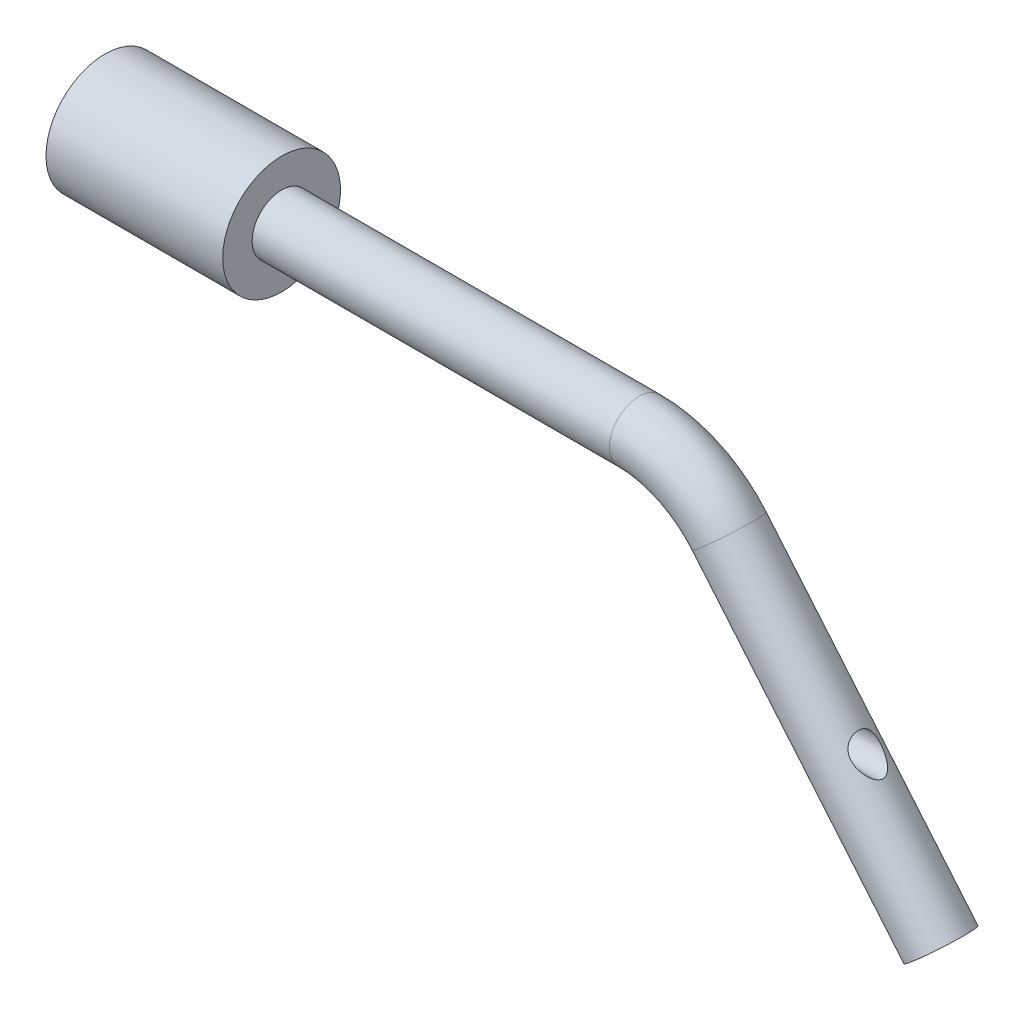
ISO-10303-21;
HEADER;
FILE_DESCRIPTION(('STEP AP214'),'2;1');
FILE_NAME('part.step','',(''),(''),'','','');
FILE_SCHEMA(('AUTOMOTIVE_DESIGN { 1 0 10303 214 1 1 1 1 }'));
ENDSEC;
DATA;
#1=APPLICATION_CONTEXT('core data for automotive mechanical design processes');
#2=APPLICATION_PROTOCOL_DEFINITION('international standard','automotive_design',2000,#1);
#3=PRODUCT_CONTEXT('',#1,'mechanical');
#4=PRODUCT('Part','Part','',(#3));
#5=PRODUCT_RELATED_PRODUCT_CATEGORY('part','',(#4));
#6=PRODUCT_DEFINITION_FORMATION('','',#4);
#7=PRODUCT_DEFINITION_CONTEXT('part definition',#1,'design');
#8=PRODUCT_DEFINITION('design','',#6,#7);
#9=PRODUCT_DEFINITION_SHAPE('','',#8);
#10=(LENGTH_UNIT() NAMED_UNIT(*) SI_UNIT(.MILLI.,.METRE.));
#11=(NAMED_UNIT(*) PLANE_ANGLE_UNIT() SI_UNIT($,.RADIAN.));
#12=(NAMED_UNIT(*) SI_UNIT($,.STERADIAN.) SOLID_ANGLE_UNIT());
#13=UNCERTAINTY_MEASURE_WITH_UNIT(LENGTH_MEASURE(1.E-05),#10,'distance_accuracy_value','');
#14=(GEOMETRIC_REPRESENTATION_CONTEXT(3) GLOBAL_UNCERTAINTY_ASSIGNED_CONTEXT((#13)) GLOBAL_UNIT_ASSIGNED_CONTEXT((#10,
#11,#12)) REPRESENTATION_CONTEXT('',''));
#15=CARTESIAN_POINT('',(0.,0.,0.));
#16=DIRECTION('',(0.,0.,1.));
#17=DIRECTION('',(1.,0.,0.));
#18=AXIS2_PLACEMENT_3D('',#15,#16,#17);
#19=CARTESIAN_POINT('',(0.,0.,0.));
#20=DIRECTION('',(1.,0.,0.));
#21=DIRECTION('',(0.,0.,-1.));
#22=AXIS2_PLACEMENT_3D('',#19,#20,#21);
#23=CYLINDRICAL_SURFACE('',#22,5.);
#24=CARTESIAN_POINT('',(90.6738468368999,0.,0.));
#25=DIRECTION('',(1.,0.,0.));
#26=DIRECTION('',(0.,0.,-1.));
#27=AXIS2_PLACEMENT_3D('',#24,#25,#26);
#28=CIRCLE('',#27,5.);
#29=CARTESIAN_POINT('',(90.6738468368999,5.,0.));
#30=VERTEX_POINT('',#29);
#31=EDGE_CURVE('E49',#30,#30,#28,.T.);
#32=ORIENTED_EDGE('',*,*,#31,.F.);
#33=EDGE_LOOP('',(#32));
#34=FACE_BOUND('',#33,.T.);
#35=CARTESIAN_POINT('',(30.,0.,0.));
#36=DIRECTION('',(-1.,0.,0.));
#37=DIRECTION('',(0.,0.,1.));
#38=AXIS2_PLACEMENT_3D('',#35,#36,#37);
#39=CIRCLE('',#38,5.);
#40=CARTESIAN_POINT('',(30.,0.,5.));
#41=VERTEX_POINT('',#40);
#42=EDGE_CURVE('E53',#41,#41,#39,.F.);
#43=ORIENTED_EDGE('',*,*,#42,.T.);
#44=EDGE_LOOP('',(#43));
#45=FACE_BOUND('',#44,.T.);
#46=ADVANCED_FACE('F31',(#34,#45),#23,.T.);
#47=CARTESIAN_POINT('',(141.954981558864,-50.,0.));
#48=DIRECTION('',(0.642787609686538,-0.766044443118979,0.));
#49=DIRECTION('',(0.,0.,-1.));
#50=AXIS2_PLACEMENT_3D('',#47,#48,#49);
#51=PLANE('',#50);
#52=CARTESIAN_POINT('',(141.954981558864,-50.,0.));
#53=DIRECTION('',(0.642787609686538,-0.766044443118979,0.));
#54=DIRECTION('',(0.,0.,-1.));
#55=AXIS2_PLACEMENT_3D('',#52,#53,#54);
#56=CIRCLE('',#55,5.);
#57=CARTESIAN_POINT('',(141.954981558864,-50.,-5.));
#58=VERTEX_POINT('',#57);
#59=EDGE_CURVE('E10',#58,#58,#56,.T.);
#60=ORIENTED_EDGE('',*,*,#59,.T.);
#61=EDGE_LOOP('',(#60));
#62=FACE_BOUND('',#61,.T.);
#63=ADVANCED_FACE('F78',(#62),#51,.T.);
#64=CARTESIAN_POINT('',(90.6738468369,-20.,0.));
#65=DIRECTION('',(0.,0.,-1.));
#66=DIRECTION('',(-1.,0.,0.));
#67=AXIS2_PLACEMENT_3D('',#64,#65,#66);
#68=TOROIDAL_SURFACE('',#67,20.,5.);
#69=CARTESIAN_POINT('',(105.99473569928,-7.14424780626931,0.));
#70=DIRECTION('',(0.642787609686534,-0.766044443118982,0.));
#71=DIRECTION('',(0.,0.,-1.));
#72=AXIS2_PLACEMENT_3D('',#69,#70,#71);
#73=CIRCLE('',#72,5.);
#74=CARTESIAN_POINT('',(109.824957914875,-3.93030975783664,0.));
#75=VERTEX_POINT('',#74);
#76=EDGE_CURVE('E44',#75,#75,#73,.T.);
#77=CARTESIAN_POINT('',(90.6738468369,-20.,0.));
#78=DIRECTION('',(0.,0.,-1.));
#79=DIRECTION('',(-1.,0.,0.));
#80=AXIS2_PLACEMENT_3D('',#77,#78,#79);
#81=CIRCLE('',#80,25.);
#82=EDGE_CURVE('',#30,#75,#81,.T.);
#83=ORIENTED_EDGE('',*,*,#31,.T.);
#84=ORIENTED_EDGE('',*,*,#76,.F.);
#85=ORIENTED_EDGE('',*,*,#82,.T.);
#86=ORIENTED_EDGE('',*,*,#82,.F.);
#87=EDGE_LOOP('',(#83,#85,#84,#86));
#88=FACE_BOUND('',#87,.T.);
#89=ADVANCED_FACE('F81',(#88),#68,.T.);
#90=CARTESIAN_POINT('',(105.99473569928,-7.14424780626931,0.));
#91=DIRECTION('',(0.642787609686538,-0.766044443118979,0.));
#92=DIRECTION('',(0.766044443118979,0.642787609686538,0.));
#93=AXIS2_PLACEMENT_3D('',#90,#91,#92);
#94=CYLINDRICAL_SURFACE('',#93,5.);
#95=CARTESIAN_POINT('',(127.924077041682,-25.5,0.));
#96=CARTESIAN_POINT('',(127.924077263838,-25.4999998009019,0.137217686490546));
#97=CARTESIAN_POINT('',(127.926150628406,-25.5113258152116,0.274432223085741));
#98=CARTESIAN_POINT('',(127.934829471353,-25.556280341531,0.545013306075348));
#99=CARTESIAN_POINT('',(127.941434785734,-25.5899080465056,0.678379991530385));
#100=CARTESIAN_POINT('',(127.960306212952,-25.6784181800909,0.937560386727098));
#101=CARTESIAN_POINT('',(127.972576365977,-25.7333157739792,1.06336863326323));
#102=CARTESIAN_POINT('',(128.004519140207,-25.8624383044972,1.3036163406416));
#103=CARTESIAN_POINT('',(128.024190589758,-25.9366601814456,1.41805759729981));
#104=CARTESIAN_POINT('',(128.072653345187,-26.1003406591129,1.63065384067217));
#105=CARTESIAN_POINT('',(128.101311560736,-26.1895686099272,1.72901650688938));
#106=CARTESIAN_POINT('',(128.169606461286,-26.3801093088825,1.90868749797591));
#107=CARTESIAN_POINT('',(128.209238728502,-26.481417184725,1.99000266250186));
#108=CARTESIAN_POINT('',(128.299359362157,-26.6890604401664,2.13235238955619));
#109=CARTESIAN_POINT('',(128.34957102308,-26.7952219568024,2.19381825198668));
#110=CARTESIAN_POINT('',(128.46116423809,-27.0104511390238,2.29894586894891));
#111=CARTESIAN_POINT('',(128.522549622098,-27.1195197900875,2.34260150213977));
#112=CARTESIAN_POINT('',(128.632016735117,-27.2989882947718,2.40086244981547));
#113=CARTESIAN_POINT('',(128.67727882858,-27.3696168737298,2.42028969901511));
#114=CARTESIAN_POINT('',(128.771502960397,-27.5099156768469,2.45254855948023));
#115=CARTESIAN_POINT('',(128.820465984016,-27.5795856399256,2.4653784072329));
#116=CARTESIAN_POINT('',(128.972285333897,-27.7865486811622,2.49477304367769));
#117=CARTESIAN_POINT('',(129.079989623984,-27.9216608783636,2.50220197942681));
#118=CARTESIAN_POINT('',(129.272174654689,-28.1464785478389,2.49747107057468));
#119=CARTESIAN_POINT('',(129.354579930744,-28.2381951602202,2.49026874482143));
#120=CARTESIAN_POINT('',(129.522648264714,-28.4174355075048,2.46655971934029));
#121=CARTESIAN_POINT('',(129.608312851483,-28.5049572300969,2.45004860165806));
#122=CARTESIAN_POINT('',(129.781968884628,-28.6759750709078,2.40849016742245));
#123=CARTESIAN_POINT('',(129.86996574719,-28.7594602605987,2.38342101310682));
#124=CARTESIAN_POINT('',(130.047102673927,-28.9222767255095,2.32526890134025));
#125=CARTESIAN_POINT('',(130.136242535344,-29.0016087251213,2.29218734709888));
#126=CARTESIAN_POINT('',(130.318372048832,-29.1593359533387,2.2167293869313));
#127=CARTESIAN_POINT('',(130.41137254391,-29.2375656179847,2.17403305948307));
#128=CARTESIAN_POINT('',(130.596667073699,-29.3896876160431,2.08008734851625));
#129=CARTESIAN_POINT('',(130.68896086774,-29.4635785244276,2.02883517590847));
#130=CARTESIAN_POINT('',(130.871354543304,-29.6065966088829,1.91755871304675));
#131=CARTESIAN_POINT('',(130.961460735221,-29.6757389048823,1.85756436463337));
#132=CARTESIAN_POINT('',(131.138301091533,-29.8090601494715,1.72798657773042));
#133=CARTESIAN_POINT('',(131.225038032462,-29.8732432299404,1.65841125930713));
#134=CARTESIAN_POINT('',(131.391504344439,-29.9946103442947,1.51013929201138));
#135=CARTESIAN_POINT('',(131.471342287974,-30.0519126247883,1.43166367667857));
#136=CARTESIAN_POINT('',(131.623312082683,-30.1596909932503,1.26321943366864));
#137=CARTESIAN_POINT('',(131.695447112212,-30.2101698989633,1.17325558014463));
#138=CARTESIAN_POINT('',(131.817749402066,-30.2949676095801,0.995617081986655));
#139=CARTESIAN_POINT('',(131.869588835608,-30.3305781444127,0.909733449166142));
#140=CARTESIAN_POINT('',(131.961388027656,-30.3932740079544,0.72893095118875));
#141=CARTESIAN_POINT('',(132.001370254106,-30.4203754661111,0.63402963009139));
#142=CARTESIAN_POINT('',(132.0581768479,-30.4587495340704,0.45897684132626));
#143=CARTESIAN_POINT('',(132.07819574656,-30.4722173321147,0.380355728918876));
#144=CARTESIAN_POINT('',(132.10702246991,-30.4915872596277,0.220180708345701));
#145=CARTESIAN_POINT('',(132.115840801845,-30.4974964798316,0.138629622762685));
#146=CARTESIAN_POINT('',(132.121393004507,-30.5012187198171,-0.025287750696442));
#147=CARTESIAN_POINT('',(132.118096324811,-30.4990112717907,-0.107655576384958));
#148=CARTESIAN_POINT('',(132.09970514866,-30.486671180842,-0.270458830530909));
#149=CARTESIAN_POINT('',(132.084602416457,-30.476533005545,-0.350892869615057));
#150=CARTESIAN_POINT('',(132.039958417005,-30.4464590840569,-0.523406880403791));
#151=CARTESIAN_POINT('',(132.008142117257,-30.4249752075342,-0.614619493250558));
#152=CARTESIAN_POINT('',(131.932819817142,-30.3737980877204,-0.789579566339376));
#153=CARTESIAN_POINT('',(131.88929306982,-30.3440902716583,-0.873313422630821));
#154=CARTESIAN_POINT('',(131.769872694095,-30.2619439130486,-1.07252841305484));
#155=CARTESIAN_POINT('',(131.688638657336,-30.2055428253632,-1.18313125694404));
#156=CARTESIAN_POINT('',(131.514320722194,-30.0826452656888,-1.38814140985642));
#157=CARTESIAN_POINT('',(131.421208129774,-30.0161242703828,-1.48250815740673));
#158=CARTESIAN_POINT('',(131.244322323398,-29.8874020959336,-1.64204908109969));
#159=CARTESIAN_POINT('',(131.161659666335,-29.8263949861898,-1.70945784100494));
#160=CARTESIAN_POINT('',(130.993089135096,-29.6997820167401,-1.83540827173603));
#161=CARTESIAN_POINT('',(130.907179159591,-29.6341731549265,-1.89394407378906));
#162=CARTESIAN_POINT('',(130.733284103796,-29.4986551884383,-2.00289908344838));
#163=CARTESIAN_POINT('',(130.645294959715,-29.4287371428499,-2.05330057256774));
#164=CARTESIAN_POINT('',(130.468475395862,-29.2849146945616,-2.14623436672073));
#165=CARTESIAN_POINT('',(130.379645170186,-29.2110111939472,-2.1887684429243));
#166=CARTESIAN_POINT('',(130.197022594473,-29.0549396854886,-2.26830343918588));
#167=CARTESIAN_POINT('',(130.103232651225,-28.972540639578,-2.30485759263927));
#168=CARTESIAN_POINT('',(129.916712584037,-28.8031790736291,-2.36920054785428));
#169=CARTESIAN_POINT('',(129.823982741456,-28.7162153748352,-2.39698707238447));
#170=CARTESIAN_POINT('',(129.640936860659,-28.5378318165357,-2.44319533134984));
#171=CARTESIAN_POINT('',(129.550615192171,-28.4464240832676,-2.46164113686503));
#172=CARTESIAN_POINT('',(129.373445571778,-28.258956471952,-2.48835262860624));
#173=CARTESIAN_POINT('',(129.286595508055,-28.162899503214,-2.49662459776499));
#174=CARTESIAN_POINT('',(129.094973570788,-27.9396979414981,-2.50239342306025));
#175=CARTESIAN_POINT('',(128.991673215364,-27.8111472256841,-2.49638901823364));
#176=CARTESIAN_POINT('',(128.796532980988,-27.5483995303215,-2.46242332345089));
#177=CARTESIAN_POINT('',(128.704675081174,-27.4142118858846,-2.43449707829228));
#178=CARTESIAN_POINT('',(128.548327687611,-27.1639574332331,-2.35912745773959));
#179=CARTESIAN_POINT('',(128.481799885882,-27.0481335855346,-2.31516572349135));
#180=CARTESIAN_POINT('',(128.361208610074,-26.8192810785208,-2.20723184973767));
#181=CARTESIAN_POINT('',(128.307140361056,-26.7062513632709,-2.14326739820072));
#182=CARTESIAN_POINT('',(128.211675502426,-26.4877035651653,-1.99510319693942));
#183=CARTESIAN_POINT('',(128.170323020274,-26.3822125945484,-1.91083475073934));
#184=CARTESIAN_POINT('',(128.099468548686,-26.1843203575462,-1.72390100727054));
#185=CARTESIAN_POINT('',(128.069968918413,-26.0919216993897,-1.62123205348411));
#186=CARTESIAN_POINT('',(128.022274705201,-25.9294897116155,-1.40711695561179));
#187=CARTESIAN_POINT('',(128.003513570206,-25.8584551861658,-1.29655205924778));
#188=CARTESIAN_POINT('',(127.972848625944,-25.7343323330958,-1.06490472647797));
#189=CARTESIAN_POINT('',(127.960945381349,-25.6812454834202,-0.943821424940056));
#190=CARTESIAN_POINT('',(127.941954525718,-25.5925111651432,-0.687947739805578));
#191=CARTESIAN_POINT('',(127.935149082697,-25.5579124553601,-0.552772077215163));
#192=CARTESIAN_POINT('',(127.926209966992,-25.5116556920969,-0.278396827854789));
#193=CARTESIAN_POINT('',(127.924076816322,-25.5000002019697,-0.13919679322078));
#194=CARTESIAN_POINT('',(127.924077041682,-25.5,0.));
#195=B_SPLINE_CURVE_WITH_KNOTS('',3,(#95,#96,#97,#98,#99,#100,#101,#102,#103,#104,#105,#106,
#107,#108,#109,#110,#111,#112,#113,#114,#115,#116,#117,#118,#119,#120,#121,#122,#123,#124,#125,
#126,#127,#128,#129,#130,#131,#132,#133,#134,#135,#136,#137,#138,#139,#140,#141,#142,#143,#144,
#145,#146,#147,#148,#149,#150,#151,#152,#153,#154,#155,#156,#157,#158,#159,#160,#161,#162,#163,
#164,#165,#166,#167,#168,#169,#170,#171,#172,#173,#174,#175,#176,#177,#178,#179,#180,#181,#182,
#183,#184,#185,#186,#187,#188,#189,#190,#191,#192,#193,#194),.UNSPECIFIED.,.T.,.F.,(4,2,2,2,2,2,
2,2,2,2,2,2,2,2,2,2,2,2,2,2,2,2,2,2,2,2,2,2,2,2,2,2,2,2,2,2,2,2,2,2,2,2,2,2,2,2,2,2,2,4),(0.,
0.411167305296201,0.822319732421716,1.23376584933878,1.64514686012809,2.0507023363275,
2.45609478622049,2.85197006781332,3.24798129657018,3.50597500555352,3.76403764152551,
4.28064433931333,4.6507533957146,5.02103825398631,5.39227512926719,5.76344703687849,
6.14952493183621,6.53572892958853,6.92063998839319,7.3052268123208,7.68177556259504,
8.05816833712492,8.37644924228201,8.69412313330582,8.93981525966591,9.18527673171265,
9.43135760814261,9.67761030071718,9.97286281807694,10.2686419075103,10.7112718182634,
11.1549919506228,11.5231347806429,11.8915200559296,12.2606972374919,12.6297912057403,
13.019680539738,13.4096710571682,13.7986513862979,14.1873913767506,14.6808093276307,
15.173440090739,15.5934913562964,16.0133813747588,16.4347125055158,16.8561274555041,
17.2525580101602,17.6490212019049,18.0660722285273,18.4831698479249),.UNSPECIFIED.);
#196=CARTESIAN_POINT('',(127.924077041682,-25.5,0.));
#197=VERTEX_POINT('',#196);
#198=EDGE_CURVE('E35',#197,#197,#195,.T.);
#199=ORIENTED_EDGE('',*,*,#198,.F.);
#200=EDGE_LOOP('',(#199));
#201=FACE_BOUND('',#200,.T.);
#202=CARTESIAN_POINT('',(117.842210298728,-28.,2.50000000000001));
#203=CARTESIAN_POINT('',(117.774393341125,-27.9191788521188,2.50000089278427));
#204=CARTESIAN_POINT('',(117.704835784105,-27.8398086869675,2.49608664085402));
#205=CARTESIAN_POINT('',(117.563069987764,-27.6841476548544,2.48120001327254));
#206=CARTESIAN_POINT('',(117.490860758756,-27.6078579603887,2.47022497654622));
#207=CARTESIAN_POINT('',(117.344256387861,-27.4581144682964,2.44175960974894));
#208=CARTESIAN_POINT('',(117.269854075541,-27.3846723547026,2.42424504584857));
#209=CARTESIAN_POINT('',(117.119784270302,-27.240888113929,2.38313635933398));
#210=CARTESIAN_POINT('',(117.044116957243,-27.1705455511365,2.35954309423552));
#211=CARTESIAN_POINT('',(116.879338717699,-27.0213252292395,2.30208995725034));
#212=CARTESIAN_POINT('',(116.790100845759,-26.9429937949701,2.26717198744435));
#213=CARTESIAN_POINT('',(116.611550231502,-26.7903383260377,2.18953270626009));
#214=CARTESIAN_POINT('',(116.522237475066,-26.7160154446505,2.14680916453705));
#215=CARTESIAN_POINT('',(116.344638597105,-26.5715428971981,2.05350752217631));
#216=CARTESIAN_POINT('',(116.256350909406,-26.5013859179823,2.00294378465777));
#217=CARTESIAN_POINT('',(116.08173735698,-26.3653125763087,1.89351892915222));
#218=CARTESIAN_POINT('',(115.995410547285,-26.2993941419514,1.83466191071557));
#219=CARTESIAN_POINT('',(115.808668795243,-26.159161502334,1.69500029176471));
#220=CARTESIAN_POINT('',(115.708973696478,-26.0858789121416,1.61216790018881));
#221=CARTESIAN_POINT('',(115.517505216085,-25.947408767112,1.43171011516712));
#222=CARTESIAN_POINT('',(115.425725729316,-25.8822149562409,1.33409628540051));
#223=CARTESIAN_POINT('',(115.274654782131,-25.7762433331832,1.14618354398115));
#224=CARTESIAN_POINT('',(115.212722514451,-25.7332851005415,1.05927284097884));
#225=CARTESIAN_POINT('',(115.100350355062,-25.6559251366408,0.874794874490144));
#226=CARTESIAN_POINT('',(115.049888452961,-25.6215070060173,0.777248561289698));
#227=CARTESIAN_POINT('',(114.97606818898,-25.5714038926119,0.598485173270723));
#228=CARTESIAN_POINT('',(114.949077709735,-25.5531782493201,0.519499144834019));
#229=CARTESIAN_POINT('',(114.906199923891,-25.5242878910601,0.357233681754043));
#230=CARTESIAN_POINT('',(114.890300524619,-25.5136149411597,0.273959029776684));
#231=CARTESIAN_POINT('',(114.871129195236,-25.5007512505529,0.104796369989899));
#232=CARTESIAN_POINT('',(114.867929022349,-25.4986087108695,0.018896267533476));
#233=CARTESIAN_POINT('',(114.874728418825,-25.503167192799,-0.152147477337064));
#234=CARTESIAN_POINT('',(114.884731027987,-25.5098702510161,-0.237290940998789));
#235=CARTESIAN_POINT('',(114.915598414384,-25.5306186580354,-0.397758403449809));
#236=CARTESIAN_POINT('',(114.935580011549,-25.5440673567637,-0.473336923117003));
#237=CARTESIAN_POINT('',(114.98428545431,-25.5769799676304,-0.620198991560656));
#238=CARTESIAN_POINT('',(115.013013001434,-25.5964464267055,-0.691480706477987));
#239=CARTESIAN_POINT('',(115.096514024374,-25.6533201396359,-0.869639247457927));
#240=CARTESIAN_POINT('',(115.156664666945,-25.6945426732563,-0.972766778461226));
#241=CARTESIAN_POINT('',(115.288955744836,-25.7862177703136,-1.16650276413229));
#242=CARTESIAN_POINT('',(115.361130575803,-25.8366968554247,-1.25707389841005));
#243=CARTESIAN_POINT('',(115.499601438745,-25.9348472785066,-1.41135180053333));
#244=CARTESIAN_POINT('',(115.564618812838,-25.9813897288886,-1.47696011256768));
#245=CARTESIAN_POINT('',(115.698433420862,-26.0783771203891,-1.60111765237353));
#246=CARTESIAN_POINT('',(115.767233083789,-26.1288245780031,-1.65966226487499));
#247=CARTESIAN_POINT('',(115.907583068177,-26.2331978798478,-1.77036972097681));
#248=CARTESIAN_POINT('',(115.979139184107,-26.2871312335167,-1.8225180349367));
#249=CARTESIAN_POINT('',(116.124007210323,-26.3980779250174,-1.92076417154707));
#250=CARTESIAN_POINT('',(116.197319574042,-26.4550920631294,-1.96686041131096));
#251=CARTESIAN_POINT('',(116.37340032538,-26.5945127275258,-2.0699645819044));
#252=CARTESIAN_POINT('',(116.476654830779,-26.6782528165669,-2.12435207991909));
#253=CARTESIAN_POINT('',(116.683675549207,-26.8511691435485,-2.2226289585956));
#254=CARTESIAN_POINT('',(116.787441994508,-26.9403481079331,-2.26651301881964));
#255=CARTESIAN_POINT('',(116.9939220931,-27.1240808517832,-2.34364584775335));
#256=CARTESIAN_POINT('',(117.096637019977,-27.2186269091188,-2.37690946209139));
#257=CARTESIAN_POINT('',(117.299628580104,-27.4132860442957,-2.43228359209697));
#258=CARTESIAN_POINT('',(117.399906737972,-27.5133955052719,-2.4544012619013));
#259=CARTESIAN_POINT('',(117.624182065791,-27.7484336624786,-2.4908959693379));
#260=CARTESIAN_POINT('',(117.746936432608,-27.8852485304597,-2.50135777498503));
#261=CARTESIAN_POINT('',(117.922821962422,-28.0968601963755,-2.49911324263164));
#262=CARTESIAN_POINT('',(117.980044143102,-28.1684172870335,-2.49538316167018));
#263=CARTESIAN_POINT('',(118.091195390376,-28.3134119606928,-2.48134674609175));
#264=CARTESIAN_POINT('',(118.145125154269,-28.3868491408026,-2.47104180928861));
#265=CARTESIAN_POINT('',(118.2806031072,-28.5801645337121,-2.43476826586228));
#266=CARTESIAN_POINT('',(118.359083612861,-28.7012178018825,-2.40309186129749));
#267=CARTESIAN_POINT('',(118.503423129586,-28.9436260839234,-2.31861214095962));
#268=CARTESIAN_POINT('',(118.56928975777,-29.0649808705769,-2.2658216351909));
#269=CARTESIAN_POINT('',(118.657692621406,-29.2435747577178,-2.16982940154207));
#270=CARTESIAN_POINT('',(118.68551027085,-29.3027441304395,-2.13487102570875));
#271=CARTESIAN_POINT('',(118.737578109044,-29.4190541453282,-2.05938864128023));
#272=CARTESIAN_POINT('',(118.761829803588,-29.4761956360291,-2.01886699593995));
#273=CARTESIAN_POINT('',(118.806849528704,-29.5877074296442,-1.93239837151244));
#274=CARTESIAN_POINT('',(118.827616626558,-29.6420769878955,-1.88644994543413));
#275=CARTESIAN_POINT('',(118.865842141446,-29.7472812522244,-1.78945140237627));
#276=CARTESIAN_POINT('',(118.883300800055,-29.7981162162198,-1.73840165830152));
#277=CARTESIAN_POINT('',(118.92789257533,-29.9345008701769,-1.58888729534211));
#278=CARTESIAN_POINT('',(118.951640691739,-30.0154129647389,-1.48507084125836));
#279=CARTESIAN_POINT('',(118.991095675528,-30.1603671840592,-1.26499463935469));
#280=CARTESIAN_POINT('',(119.006802792752,-30.2244098329455,-1.14873527828952));
#281=CARTESIAN_POINT('',(119.032077943447,-30.3337595428928,-0.906281128842655));
#282=CARTESIAN_POINT('',(119.04161024898,-30.3789570376382,-0.780033179570827));
#283=CARTESIAN_POINT('',(119.055788109884,-30.4486230532557,-0.521685095579027));
#284=CARTESIAN_POINT('',(119.060433231988,-30.4730897362296,-0.389584443077594));
#285=CARTESIAN_POINT('',(119.065688709032,-30.5008930291819,-0.11983277904985));
#286=CARTESIAN_POINT('',(119.066197975668,-30.5037001565244,0.017875040077584));
#287=CARTESIAN_POINT('',(119.063012314887,-30.4866976933923,0.291849515159918));
#288=CARTESIAN_POINT('',(119.059316971253,-30.4668858638512,0.428116027091039));
#289=CARTESIAN_POINT('',(119.047013103444,-30.4050706074086,0.696179658979911));
#290=CARTESIAN_POINT('',(119.038374732926,-30.3629324883377,0.827944428233023));
#291=CARTESIAN_POINT('',(119.014758141764,-30.2577904971942,1.08226998177188));
#292=CARTESIAN_POINT('',(118.99978030448,-30.1947878868837,1.20483132207733));
#293=CARTESIAN_POINT('',(118.961767984376,-30.0511127113309,1.43568584523685));
#294=CARTESIAN_POINT('',(118.938831978361,-29.9706604380329,1.54413211272252));
#295=CARTESIAN_POINT('',(118.882855032127,-29.7949752231925,1.74524291620884));
#296=CARTESIAN_POINT('',(118.84981898733,-29.6997494532558,1.83791506401939));
#297=CARTESIAN_POINT('',(118.773139491225,-29.5015420665519,2.00288496560486));
#298=CARTESIAN_POINT('',(118.729810840755,-29.3988437787413,2.07567060931335));
#299=CARTESIAN_POINT('',(118.631623773567,-29.1879202138889,2.20319046027939));
#300=CARTESIAN_POINT('',(118.576762561396,-29.0796936016249,2.25792028259091));
#301=CARTESIAN_POINT('',(118.454985980616,-28.8596857784013,2.35063852718693));
#302=CARTESIAN_POINT('',(118.387848221675,-28.7478770338133,2.38826396884151));
#303=CARTESIAN_POINT('',(118.243957941372,-28.5261929463953,2.44668646316251));
#304=CARTESIAN_POINT('',(118.167207147415,-28.416317260242,2.46748653424928));
#305=CARTESIAN_POINT('',(118.047580182571,-28.2560204070425,2.48741784293967));
#306=CARTESIAN_POINT('',(118.007560584839,-28.2040574946134,2.49219150647361));
#307=CARTESIAN_POINT('',(117.92598819638,-28.1012094280272,2.49848100447782));
#308=CARTESIAN_POINT('',(117.884436658778,-28.050323444323,2.49999944410615));
#309=CARTESIAN_POINT('',(117.842210298728,-28.,2.50000000000001));
#310=B_SPLINE_CURVE_WITH_KNOTS('',3,(#202,#203,#204,#205,#206,#207,#208,#209,#210,#211,#212,
#213,#214,#215,#216,#217,#218,#219,#220,#221,#222,#223,#224,#225,#226,#227,#228,#229,#230,#231,
#232,#233,#234,#235,#236,#237,#238,#239,#240,#241,#242,#243,#244,#245,#246,#247,#248,#249,#250,
#251,#252,#253,#254,#255,#256,#257,#258,#259,#260,#261,#262,#263,#264,#265,#266,#267,#268,#269,
#270,#271,#272,#273,#274,#275,#276,#277,#278,#279,#280,#281,#282,#283,#284,#285,#286,#287,#288,
#289,#290,#291,#292,#293,#294,#295,#296,#297,#298,#299,#300,#301,#302,#303,#304,#305,#306,#307,
#308,#309),.UNSPECIFIED.,.T.,.F.,(4,2,2,2,2,2,2,2,2,2,2,2,2,2,2,2,2,2,2,2,2,2,2,2,2,2,2,2,2,2,2,
2,2,2,2,2,2,2,2,2,2,2,2,2,2,2,2,2,2,2,2,2,2,4),(0.,0.316452102747234,0.633023540176485,
0.95077994618754,1.26849155116872,1.63947100381586,2.01055662547017,2.38097028558032,
2.75120148031209,3.19698166440682,3.64241489449699,3.98650934238041,4.32993782889942,
4.58525954617519,4.84030244765685,5.09678443921739,5.35332549331792,5.59037190876756,
5.82751878862515,6.20427500674956,6.58212806170855,6.89199807622621,7.20206946920237,
7.51283265555835,7.82367695907968,8.25405481172109,8.68465020983687,9.11464104447462,
9.54435553250745,10.0946851269166,10.3695190070967,10.6442944770763,11.0855802290527,
11.5265986564482,11.7487474857716,11.9708022374648,12.1929163318436,12.4150142016108,
12.8141931272999,13.2133596491725,13.6148156235826,14.0163071855071,14.4275833138826,
14.8389001583011,15.2527271714942,15.666529163426,16.0753832209432,16.484039422931,
16.8815196492045,17.2790963345908,17.6847559142379,18.0903427036395,18.2875400947771,
18.4845796096938),.UNSPECIFIED.);
#311=CARTESIAN_POINT('',(117.842210298728,-28.,2.50000000000001));
#312=VERTEX_POINT('',#311);
#313=EDGE_CURVE('E56',#312,#312,#310,.T.);
#314=ORIENTED_EDGE('',*,*,#313,.F.);
#315=EDGE_LOOP('',(#314));
#316=FACE_BOUND('',#315,.T.);
#317=ORIENTED_EDGE('',*,*,#59,.F.);
#318=EDGE_LOOP('',(#317));
#319=FACE_BOUND('',#318,.T.);
#320=ORIENTED_EDGE('',*,*,#76,.T.);
#321=EDGE_LOOP('',(#320));
#322=FACE_BOUND('',#321,.T.);
#323=ADVANCED_FACE('F61',(#201,#316,#319,#322),#94,.T.);
#324=CARTESIAN_POINT('',(30.,0.,0.));
#325=DIRECTION('',(-1.,0.,0.));
#326=DIRECTION('',(0.,0.,1.));
#327=AXIS2_PLACEMENT_3D('',#324,#325,#326);
#328=CYLINDRICAL_SURFACE('',#327,10.);
#329=CARTESIAN_POINT('',(30.,0.,0.));
#330=DIRECTION('',(-1.,0.,0.));
#331=DIRECTION('',(0.,0.,1.));
#332=AXIS2_PLACEMENT_3D('',#329,#330,#331);
#333=CIRCLE('',#332,10.);
#334=CARTESIAN_POINT('',(30.,0.,10.));
#335=VERTEX_POINT('',#334);
#336=EDGE_CURVE('E55',#335,#335,#333,.T.);
#337=ORIENTED_EDGE('',*,*,#336,.T.);
#338=EDGE_LOOP('',(#337));
#339=FACE_BOUND('',#338,.T.);
#340=CARTESIAN_POINT('',(0.,0.,0.));
#341=DIRECTION('',(-1.,0.,0.));
#342=DIRECTION('',(0.,0.,1.));
#343=AXIS2_PLACEMENT_3D('',#340,#341,#342);
#344=CIRCLE('',#343,10.);
#345=CARTESIAN_POINT('',(0.,0.,10.));
#346=VERTEX_POINT('',#345);
#347=EDGE_CURVE('E94',#346,#346,#344,.T.);
#348=ORIENTED_EDGE('',*,*,#347,.F.);
#349=EDGE_LOOP('',(#348));
#350=FACE_BOUND('',#349,.T.);
#351=ADVANCED_FACE('F73',(#339,#350),#328,.T.);
#352=CARTESIAN_POINT('',(30.,0.,0.));
#353=DIRECTION('',(-1.,0.,0.));
#354=DIRECTION('',(0.,0.,1.));
#355=AXIS2_PLACEMENT_3D('',#352,#353,#354);
#356=PLANE('',#355);
#357=ORIENTED_EDGE('',*,*,#42,.F.);
#358=EDGE_LOOP('',(#357));
#359=FACE_BOUND('',#358,.T.);
#360=ORIENTED_EDGE('',*,*,#336,.F.);
#361=EDGE_LOOP('',(#360));
#362=FACE_BOUND('',#361,.T.);
#363=ADVANCED_FACE('F69',(#359,#362),#356,.F.);
#364=CARTESIAN_POINT('',(0.,0.,0.));
#365=DIRECTION('',(1.,0.,0.));
#366=DIRECTION('',(0.,0.,-1.));
#367=AXIS2_PLACEMENT_3D('',#364,#365,#366);
#368=PLANE('',#367);
#369=ORIENTED_EDGE('',*,*,#347,.T.);
#370=EDGE_LOOP('',(#369));
#371=FACE_BOUND('',#370,.T.);
#372=ADVANCED_FACE('F33',(#371),#368,.F.);
#373=CARTESIAN_POINT('',(145.785203774459,-28.,0.));
#374=DIRECTION('',(-1.,0.,0.));
#375=DIRECTION('',(0.,0.,1.));
#376=AXIS2_PLACEMENT_3D('',#373,#374,#375);
#377=CYLINDRICAL_SURFACE('',#376,2.5);
#378=ORIENTED_EDGE('',*,*,#198,.T.);
#379=EDGE_LOOP('',(#378));
#380=FACE_BOUND('',#379,.T.);
#381=ORIENTED_EDGE('',*,*,#313,.T.);
#382=EDGE_LOOP('',(#381));
#383=FACE_BOUND('',#382,.T.);
#384=ADVANCED_FACE('F64',(#380,#383),#377,.F.);
#385=CLOSED_SHELL('',(#46,#63,#89,#323,#351,#363,#372,#384));
#386=MANIFOLD_SOLID_BREP('B2',#385);
#387=ADVANCED_BREP_SHAPE_REPRESENTATION('',(#18,#386),#14);
#388=SHAPE_DEFINITION_REPRESENTATION(#9,#387);
ENDSEC;
END-ISO-10303-21;
